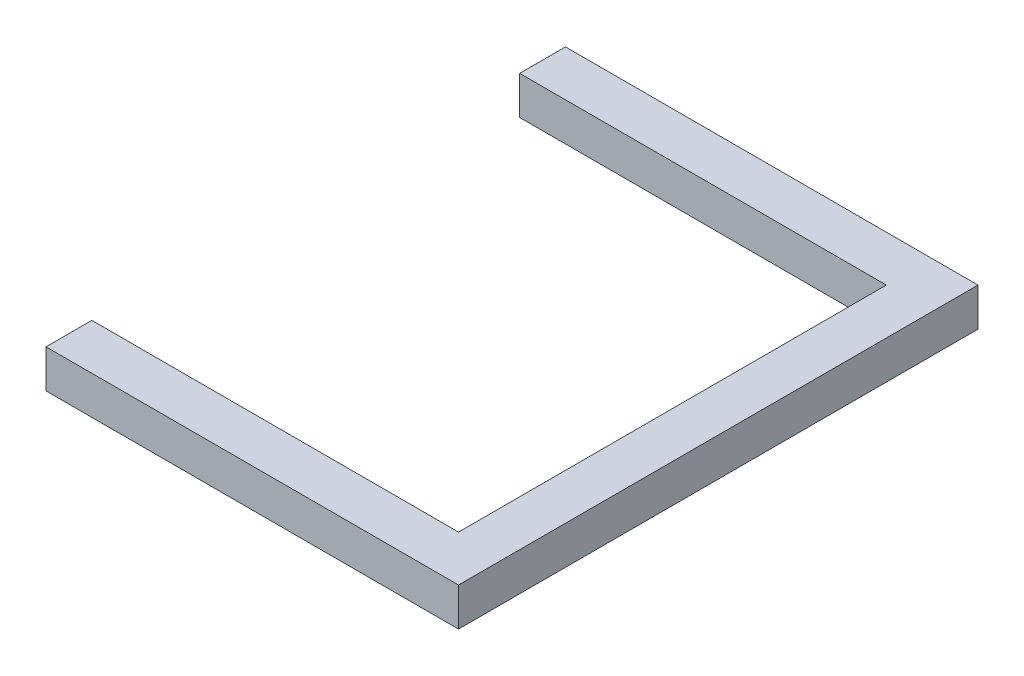
ISO-10303-21;
HEADER;
FILE_DESCRIPTION(('STEP AP214'),'2;1');
FILE_NAME('part.step','',(''),(''),'','','');
FILE_SCHEMA(('AUTOMOTIVE_DESIGN { 1 0 10303 214 1 1 1 1 }'));
ENDSEC;
DATA;
#1=APPLICATION_CONTEXT('core data for automotive mechanical design processes');
#2=APPLICATION_PROTOCOL_DEFINITION('international standard','automotive_design',2000,#1);
#3=PRODUCT_CONTEXT('',#1,'mechanical');
#4=PRODUCT('Part','Part','',(#3));
#5=PRODUCT_RELATED_PRODUCT_CATEGORY('part','',(#4));
#6=PRODUCT_DEFINITION_FORMATION('','',#4);
#7=PRODUCT_DEFINITION_CONTEXT('part definition',#1,'design');
#8=PRODUCT_DEFINITION('design','',#6,#7);
#9=PRODUCT_DEFINITION_SHAPE('','',#8);
#10=(LENGTH_UNIT() NAMED_UNIT(*) SI_UNIT(.MILLI.,.METRE.));
#11=(NAMED_UNIT(*) PLANE_ANGLE_UNIT() SI_UNIT($,.RADIAN.));
#12=(NAMED_UNIT(*) SI_UNIT($,.STERADIAN.) SOLID_ANGLE_UNIT());
#13=UNCERTAINTY_MEASURE_WITH_UNIT(LENGTH_MEASURE(1.E-05),#10,'distance_accuracy_value','');
#14=(GEOMETRIC_REPRESENTATION_CONTEXT(3) GLOBAL_UNCERTAINTY_ASSIGNED_CONTEXT((#13)) GLOBAL_UNIT_ASSIGNED_CONTEXT((#10,
#11,#12)) REPRESENTATION_CONTEXT('',''));
#15=CARTESIAN_POINT('',(0.,0.,0.));
#16=DIRECTION('',(0.,0.,1.));
#17=DIRECTION('',(1.,0.,0.));
#18=AXIS2_PLACEMENT_3D('',#15,#16,#17);
#19=CARTESIAN_POINT('',(3.,2.5,-17.));
#20=DIRECTION('',(-1.,0.,0.));
#21=DIRECTION('',(0.,0.,1.));
#22=AXIS2_PLACEMENT_3D('',#19,#20,#21);
#23=PLANE('',#22);
#24=DIRECTION('',(0.,0.,-1.));
#25=VECTOR('',#24,1.);
#26=CARTESIAN_POINT('',(3.,0.,-17.));
#27=LINE('',#26,#25);
#28=CARTESIAN_POINT('',(3.,0.,17.));
#29=VERTEX_POINT('',#28);
#30=CARTESIAN_POINT('',(3.,0.,-17.));
#31=VERTEX_POINT('',#30);
#32=EDGE_CURVE('E146',#29,#31,#27,.T.);
#33=ORIENTED_EDGE('',*,*,#32,.T.);
#34=DIRECTION('',(0.,-1.,0.));
#35=VECTOR('',#34,1.);
#36=CARTESIAN_POINT('',(3.,2.5,-17.));
#37=LINE('',#36,#35);
#38=CARTESIAN_POINT('',(3.,2.5,-17.));
#39=VERTEX_POINT('',#38);
#40=EDGE_CURVE('E11',#39,#31,#37,.T.);
#41=ORIENTED_EDGE('',*,*,#40,.F.);
#42=DIRECTION('',(0.,0.,-1.));
#43=VECTOR('',#42,1.);
#44=CARTESIAN_POINT('',(3.,2.5,-17.));
#45=LINE('',#44,#43);
#46=CARTESIAN_POINT('',(3.,2.5,17.));
#47=VERTEX_POINT('',#46);
#48=EDGE_CURVE('E168',#47,#39,#45,.T.);
#49=ORIENTED_EDGE('',*,*,#48,.F.);
#50=DIRECTION('',(0.,-1.,0.));
#51=VECTOR('',#50,1.);
#52=CARTESIAN_POINT('',(3.,2.5,17.));
#53=LINE('',#52,#51);
#54=EDGE_CURVE('E142',#47,#29,#53,.T.);
#55=ORIENTED_EDGE('',*,*,#54,.T.);
#56=EDGE_LOOP('',(#33,#41,#49,#55));
#57=FACE_BOUND('',#56,.T.);
#58=ADVANCED_FACE('F45',(#57),#23,.F.);
#59=CARTESIAN_POINT('',(3.,2.5,-17.));
#60=DIRECTION('',(0.,0.,1.));
#61=DIRECTION('',(1.,0.,0.));
#62=AXIS2_PLACEMENT_3D('',#59,#60,#61);
#63=PLANE('',#62);
#64=DIRECTION('',(-1.,0.,0.));
#65=VECTOR('',#64,1.);
#66=CARTESIAN_POINT('',(3.,0.,-17.));
#67=LINE('',#66,#65);
#68=CARTESIAN_POINT('',(-24.,0.,-17.));
#69=VERTEX_POINT('',#68);
#70=EDGE_CURVE('E150',#31,#69,#67,.T.);
#71=ORIENTED_EDGE('',*,*,#70,.T.);
#72=DIRECTION('',(0.,-1.,0.));
#73=VECTOR('',#72,1.);
#74=CARTESIAN_POINT('',(-24.,2.5,-17.));
#75=LINE('',#74,#73);
#76=CARTESIAN_POINT('',(-24.,2.5,-17.));
#77=VERTEX_POINT('',#76);
#78=EDGE_CURVE('E54',#77,#69,#75,.T.);
#79=ORIENTED_EDGE('',*,*,#78,.F.);
#80=DIRECTION('',(-1.,0.,0.));
#81=VECTOR('',#80,1.);
#82=CARTESIAN_POINT('',(3.,2.5,-17.));
#83=LINE('',#82,#81);
#84=EDGE_CURVE('E105',#39,#77,#83,.T.);
#85=ORIENTED_EDGE('',*,*,#84,.F.);
#86=ORIENTED_EDGE('',*,*,#40,.T.);
#87=EDGE_LOOP('',(#71,#79,#85,#86));
#88=FACE_BOUND('',#87,.T.);
#89=ADVANCED_FACE('F214',(#88),#63,.F.);
#90=CARTESIAN_POINT('',(-24.,2.5,-17.));
#91=DIRECTION('',(1.,0.,0.));
#92=DIRECTION('',(0.,0.,-1.));
#93=AXIS2_PLACEMENT_3D('',#90,#91,#92);
#94=PLANE('',#93);
#95=DIRECTION('',(0.,0.,1.));
#96=VECTOR('',#95,1.);
#97=CARTESIAN_POINT('',(-24.,0.,-17.));
#98=LINE('',#97,#96);
#99=CARTESIAN_POINT('',(-24.,0.,-14.));
#100=VERTEX_POINT('',#99);
#101=EDGE_CURVE('E153',#69,#100,#98,.T.);
#102=ORIENTED_EDGE('',*,*,#101,.T.);
#103=DIRECTION('',(0.,-1.,0.));
#104=VECTOR('',#103,1.);
#105=CARTESIAN_POINT('',(-24.,2.5,-14.));
#106=LINE('',#105,#104);
#107=CARTESIAN_POINT('',(-24.,2.5,-14.));
#108=VERTEX_POINT('',#107);
#109=EDGE_CURVE('E179',#108,#100,#106,.T.);
#110=ORIENTED_EDGE('',*,*,#109,.F.);
#111=DIRECTION('',(0.,0.,1.));
#112=VECTOR('',#111,1.);
#113=CARTESIAN_POINT('',(-24.,2.5,-17.));
#114=LINE('',#113,#112);
#115=EDGE_CURVE('E189',#77,#108,#114,.T.);
#116=ORIENTED_EDGE('',*,*,#115,.F.);
#117=ORIENTED_EDGE('',*,*,#78,.T.);
#118=EDGE_LOOP('',(#102,#110,#116,#117));
#119=FACE_BOUND('',#118,.T.);
#120=ADVANCED_FACE('F187',(#119),#94,.F.);
#121=CARTESIAN_POINT('',(0.,2.5,-14.));
#122=DIRECTION('',(0.,0.,-1.));
#123=DIRECTION('',(-1.,0.,0.));
#124=AXIS2_PLACEMENT_3D('',#121,#122,#123);
#125=PLANE('',#124);
#126=DIRECTION('',(1.,0.,0.));
#127=VECTOR('',#126,1.);
#128=CARTESIAN_POINT('',(0.,0.,-14.));
#129=LINE('',#128,#127);
#130=CARTESIAN_POINT('',(0.,0.,-14.));
#131=VERTEX_POINT('',#130);
#132=EDGE_CURVE('E156',#100,#131,#129,.T.);
#133=ORIENTED_EDGE('',*,*,#132,.T.);
#134=DIRECTION('',(0.,-1.,0.));
#135=VECTOR('',#134,1.);
#136=CARTESIAN_POINT('',(0.,2.5,-14.));
#137=LINE('',#136,#135);
#138=CARTESIAN_POINT('',(0.,2.5,-14.));
#139=VERTEX_POINT('',#138);
#140=EDGE_CURVE('E175',#139,#131,#137,.T.);
#141=ORIENTED_EDGE('',*,*,#140,.F.);
#142=DIRECTION('',(1.,0.,0.));
#143=VECTOR('',#142,1.);
#144=CARTESIAN_POINT('',(0.,2.5,-14.));
#145=LINE('',#144,#143);
#146=EDGE_CURVE('E202',#108,#139,#145,.T.);
#147=ORIENTED_EDGE('',*,*,#146,.F.);
#148=ORIENTED_EDGE('',*,*,#109,.T.);
#149=EDGE_LOOP('',(#133,#141,#147,#148));
#150=FACE_BOUND('',#149,.T.);
#151=ADVANCED_FACE('F197',(#150),#125,.F.);
#152=CARTESIAN_POINT('',(0.,2.5,-14.));
#153=DIRECTION('',(1.,0.,0.));
#154=DIRECTION('',(0.,0.,-1.));
#155=AXIS2_PLACEMENT_3D('',#152,#153,#154);
#156=PLANE('',#155);
#157=DIRECTION('',(0.,0.,1.));
#158=VECTOR('',#157,1.);
#159=CARTESIAN_POINT('',(0.,0.,-14.));
#160=LINE('',#159,#158);
#161=CARTESIAN_POINT('',(0.,0.,14.));
#162=VERTEX_POINT('',#161);
#163=EDGE_CURVE('E159',#131,#162,#160,.T.);
#164=ORIENTED_EDGE('',*,*,#163,.T.);
#165=DIRECTION('',(0.,-1.,0.));
#166=VECTOR('',#165,1.);
#167=CARTESIAN_POINT('',(0.,2.5,14.));
#168=LINE('',#167,#166);
#169=CARTESIAN_POINT('',(0.,2.5,14.));
#170=VERTEX_POINT('',#169);
#171=EDGE_CURVE('E135',#170,#162,#168,.T.);
#172=ORIENTED_EDGE('',*,*,#171,.F.);
#173=DIRECTION('',(0.,0.,1.));
#174=VECTOR('',#173,1.);
#175=CARTESIAN_POINT('',(0.,2.5,-14.));
#176=LINE('',#175,#174);
#177=EDGE_CURVE('E124',#139,#170,#176,.T.);
#178=ORIENTED_EDGE('',*,*,#177,.F.);
#179=ORIENTED_EDGE('',*,*,#140,.T.);
#180=EDGE_LOOP('',(#164,#172,#178,#179));
#181=FACE_BOUND('',#180,.T.);
#182=ADVANCED_FACE('F200',(#181),#156,.F.);
#183=CARTESIAN_POINT('',(0.,2.5,14.));
#184=DIRECTION('',(0.,0.,1.));
#185=DIRECTION('',(1.,0.,0.));
#186=AXIS2_PLACEMENT_3D('',#183,#184,#185);
#187=PLANE('',#186);
#188=DIRECTION('',(-1.,0.,0.));
#189=VECTOR('',#188,1.);
#190=CARTESIAN_POINT('',(0.,0.,14.));
#191=LINE('',#190,#189);
#192=CARTESIAN_POINT('',(-24.,0.,14.));
#193=VERTEX_POINT('',#192);
#194=EDGE_CURVE('E133',#162,#193,#191,.T.);
#195=ORIENTED_EDGE('',*,*,#194,.T.);
#196=DIRECTION('',(0.,-1.,0.));
#197=VECTOR('',#196,1.);
#198=CARTESIAN_POINT('',(-24.,2.5,14.));
#199=LINE('',#198,#197);
#200=CARTESIAN_POINT('',(-24.,2.5,14.));
#201=VERTEX_POINT('',#200);
#202=EDGE_CURVE('E130',#201,#193,#199,.T.);
#203=ORIENTED_EDGE('',*,*,#202,.F.);
#204=DIRECTION('',(-1.,0.,0.));
#205=VECTOR('',#204,1.);
#206=CARTESIAN_POINT('',(0.,2.5,14.));
#207=LINE('',#206,#205);
#208=EDGE_CURVE('E118',#170,#201,#207,.T.);
#209=ORIENTED_EDGE('',*,*,#208,.F.);
#210=ORIENTED_EDGE('',*,*,#171,.T.);
#211=EDGE_LOOP('',(#195,#203,#209,#210));
#212=FACE_BOUND('',#211,.T.);
#213=ADVANCED_FACE('F131',(#212),#187,.F.);
#214=CARTESIAN_POINT('',(-24.,2.5,14.));
#215=DIRECTION('',(1.,0.,0.));
#216=DIRECTION('',(0.,0.,-1.));
#217=AXIS2_PLACEMENT_3D('',#214,#215,#216);
#218=PLANE('',#217);
#219=DIRECTION('',(0.,0.,1.));
#220=VECTOR('',#219,1.);
#221=CARTESIAN_POINT('',(-24.,0.,14.));
#222=LINE('',#221,#220);
#223=CARTESIAN_POINT('',(-24.,0.,17.));
#224=VERTEX_POINT('',#223);
#225=EDGE_CURVE('E91',#193,#224,#222,.T.);
#226=ORIENTED_EDGE('',*,*,#225,.T.);
#227=DIRECTION('',(0.,-1.,0.));
#228=VECTOR('',#227,1.);
#229=CARTESIAN_POINT('',(-24.,2.5,17.));
#230=LINE('',#229,#228);
#231=CARTESIAN_POINT('',(-24.,2.5,17.));
#232=VERTEX_POINT('',#231);
#233=EDGE_CURVE('E136',#232,#224,#230,.T.);
#234=ORIENTED_EDGE('',*,*,#233,.F.);
#235=DIRECTION('',(0.,0.,1.));
#236=VECTOR('',#235,1.);
#237=CARTESIAN_POINT('',(-24.,2.5,14.));
#238=LINE('',#237,#236);
#239=EDGE_CURVE('E122',#201,#232,#238,.T.);
#240=ORIENTED_EDGE('',*,*,#239,.F.);
#241=ORIENTED_EDGE('',*,*,#202,.T.);
#242=EDGE_LOOP('',(#226,#234,#240,#241));
#243=FACE_BOUND('',#242,.T.);
#244=ADVANCED_FACE('F138',(#243),#218,.F.);
#245=CARTESIAN_POINT('',(3.,2.5,17.));
#246=DIRECTION('',(0.,0.,-1.));
#247=DIRECTION('',(-1.,0.,0.));
#248=AXIS2_PLACEMENT_3D('',#245,#246,#247);
#249=PLANE('',#248);
#250=DIRECTION('',(1.,0.,0.));
#251=VECTOR('',#250,1.);
#252=CARTESIAN_POINT('',(3.,0.,17.));
#253=LINE('',#252,#251);
#254=EDGE_CURVE('E97',#224,#29,#253,.T.);
#255=ORIENTED_EDGE('',*,*,#254,.T.);
#256=ORIENTED_EDGE('',*,*,#54,.F.);
#257=DIRECTION('',(1.,0.,0.));
#258=VECTOR('',#257,1.);
#259=CARTESIAN_POINT('',(3.,2.5,17.));
#260=LINE('',#259,#258);
#261=EDGE_CURVE('E62',#232,#47,#260,.T.);
#262=ORIENTED_EDGE('',*,*,#261,.F.);
#263=ORIENTED_EDGE('',*,*,#233,.T.);
#264=EDGE_LOOP('',(#255,#256,#262,#263));
#265=FACE_BOUND('',#264,.T.);
#266=ADVANCED_FACE('F230',(#265),#249,.F.);
#267=CARTESIAN_POINT('',(0.,2.5,0.));
#268=DIRECTION('',(0.,-1.,0.));
#269=DIRECTION('',(0.,0.,-1.));
#270=AXIS2_PLACEMENT_3D('',#267,#268,#269);
#271=PLANE('',#270);
#272=ORIENTED_EDGE('',*,*,#48,.T.);
#273=ORIENTED_EDGE('',*,*,#84,.T.);
#274=ORIENTED_EDGE('',*,*,#115,.T.);
#275=ORIENTED_EDGE('',*,*,#146,.T.);
#276=ORIENTED_EDGE('',*,*,#177,.T.);
#277=ORIENTED_EDGE('',*,*,#208,.T.);
#278=ORIENTED_EDGE('',*,*,#239,.T.);
#279=ORIENTED_EDGE('',*,*,#261,.T.);
#280=EDGE_LOOP('',(#272,#273,#274,#275,#276,#277,#278,#279));
#281=FACE_BOUND('',#280,.T.);
#282=ADVANCED_FACE('F120',(#281),#271,.F.);
#283=CARTESIAN_POINT('',(0.,0.,0.));
#284=DIRECTION('',(0.,-1.,0.));
#285=DIRECTION('',(0.,0.,-1.));
#286=AXIS2_PLACEMENT_3D('',#283,#284,#285);
#287=PLANE('',#286);
#288=ORIENTED_EDGE('',*,*,#32,.F.);
#289=ORIENTED_EDGE('',*,*,#254,.F.);
#290=ORIENTED_EDGE('',*,*,#225,.F.);
#291=ORIENTED_EDGE('',*,*,#194,.F.);
#292=ORIENTED_EDGE('',*,*,#163,.F.);
#293=ORIENTED_EDGE('',*,*,#132,.F.);
#294=ORIENTED_EDGE('',*,*,#101,.F.);
#295=ORIENTED_EDGE('',*,*,#70,.F.);
#296=EDGE_LOOP('',(#288,#289,#290,#291,#292,#293,#294,#295));
#297=FACE_BOUND('',#296,.T.);
#298=ADVANCED_FACE('F193',(#297),#287,.T.);
#299=CLOSED_SHELL('',(#58,#89,#120,#151,#182,#213,#244,#266,#282,#298));
#300=MANIFOLD_SOLID_BREP('B2',#299);
#301=ADVANCED_BREP_SHAPE_REPRESENTATION('',(#18,#300),#14);
#302=SHAPE_DEFINITION_REPRESENTATION(#9,#301);
ENDSEC;
END-ISO-10303-21;
